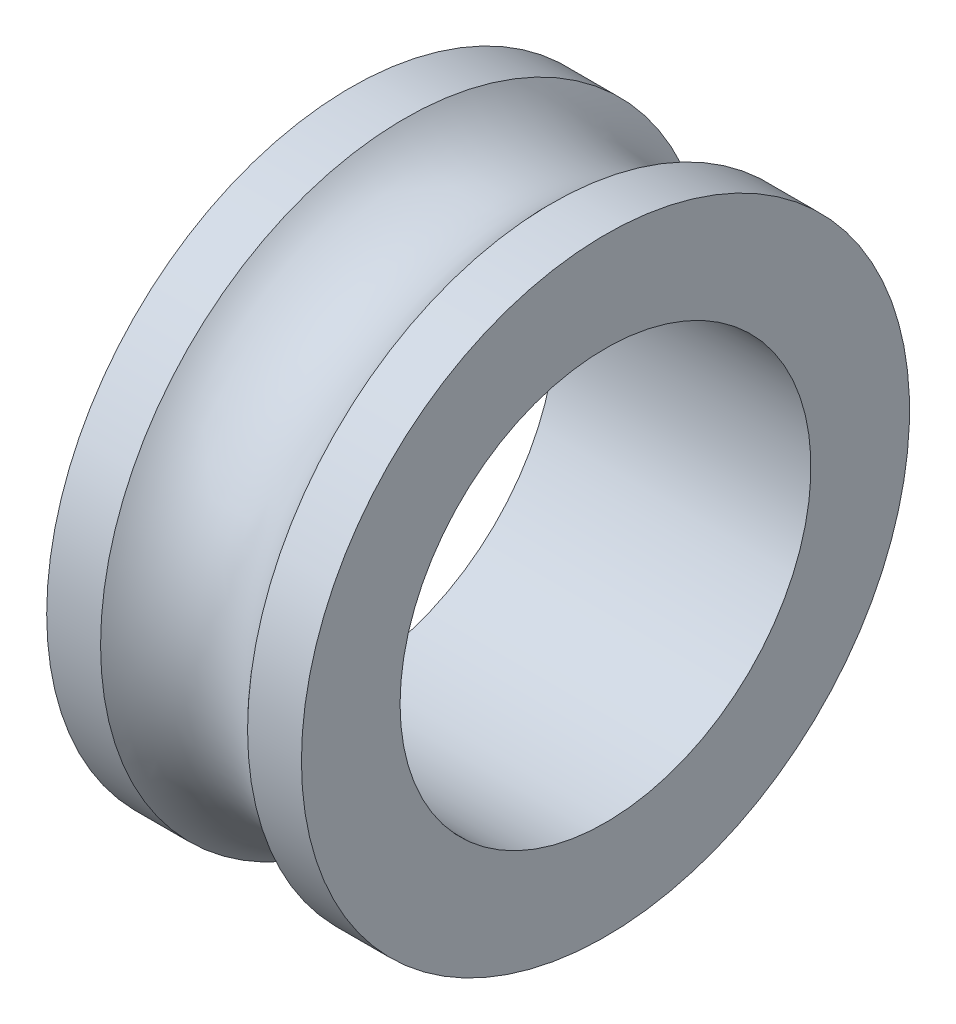
ISO-10303-21;
HEADER;
FILE_DESCRIPTION(('STEP AP214'),'2;1');
FILE_NAME('part.step','',(''),(''),'','','');
FILE_SCHEMA(('AUTOMOTIVE_DESIGN { 1 0 10303 214 1 1 1 1 }'));
ENDSEC;
DATA;
#1=APPLICATION_CONTEXT('core data for automotive mechanical design processes');
#2=APPLICATION_PROTOCOL_DEFINITION('international standard','automotive_design',2000,#1);
#3=PRODUCT_CONTEXT('',#1,'mechanical');
#4=PRODUCT('Part','Part','',(#3));
#5=PRODUCT_RELATED_PRODUCT_CATEGORY('part','',(#4));
#6=PRODUCT_DEFINITION_FORMATION('','',#4);
#7=PRODUCT_DEFINITION_CONTEXT('part definition',#1,'design');
#8=PRODUCT_DEFINITION('design','',#6,#7);
#9=PRODUCT_DEFINITION_SHAPE('','',#8);
#10=(LENGTH_UNIT() NAMED_UNIT(*) SI_UNIT(.MILLI.,.METRE.));
#11=(NAMED_UNIT(*) PLANE_ANGLE_UNIT() SI_UNIT($,.RADIAN.));
#12=(NAMED_UNIT(*) SI_UNIT($,.STERADIAN.) SOLID_ANGLE_UNIT());
#13=UNCERTAINTY_MEASURE_WITH_UNIT(LENGTH_MEASURE(1.E-05),#10,'distance_accuracy_value','');
#14=(GEOMETRIC_REPRESENTATION_CONTEXT(3) GLOBAL_UNCERTAINTY_ASSIGNED_CONTEXT((#13)) GLOBAL_UNIT_ASSIGNED_CONTEXT((#10,
#11,#12)) REPRESENTATION_CONTEXT('',''));
#15=CARTESIAN_POINT('',(0.,0.,0.));
#16=DIRECTION('',(0.,0.,1.));
#17=DIRECTION('',(1.,0.,0.));
#18=AXIS2_PLACEMENT_3D('',#15,#16,#17);
#19=CARTESIAN_POINT('',(-15.5,37.,0.));
#20=DIRECTION('',(1.,0.,0.));
#21=DIRECTION('',(0.,0.,-1.));
#22=AXIS2_PLACEMENT_3D('',#19,#20,#21);
#23=PLANE('',#22);
#24=CARTESIAN_POINT('',(-15.5,0.,0.));
#25=DIRECTION('',(-1.,0.,0.));
#26=DIRECTION('',(0.,0.,1.));
#27=AXIS2_PLACEMENT_3D('',#24,#25,#26);
#28=CIRCLE('',#27,25.);
#29=CARTESIAN_POINT('',(-15.5,0.,25.));
#30=VERTEX_POINT('',#29);
#31=EDGE_CURVE('E10',#30,#30,#28,.T.);
#32=ORIENTED_EDGE('',*,*,#31,.F.);
#33=EDGE_LOOP('',(#32));
#34=FACE_BOUND('',#33,.T.);
#35=CARTESIAN_POINT('',(-15.5,0.,0.));
#36=DIRECTION('',(-1.,0.,0.));
#37=DIRECTION('',(0.,0.,1.));
#38=AXIS2_PLACEMENT_3D('',#35,#36,#37);
#39=CIRCLE('',#38,37.);
#40=CARTESIAN_POINT('',(-15.5,0.,37.));
#41=VERTEX_POINT('',#40);
#42=EDGE_CURVE('E57',#41,#41,#39,.T.);
#43=ORIENTED_EDGE('',*,*,#42,.T.);
#44=EDGE_LOOP('',(#43));
#45=FACE_BOUND('',#44,.T.);
#46=ADVANCED_FACE('F35',(#34,#45),#23,.F.);
#47=CARTESIAN_POINT('',(-15.5,0.,0.));
#48=DIRECTION('',(-1.,0.,0.));
#49=DIRECTION('',(0.,0.,1.));
#50=AXIS2_PLACEMENT_3D('',#47,#48,#49);
#51=CYLINDRICAL_SURFACE('',#50,25.);
#52=CARTESIAN_POINT('',(15.5,0.,0.));
#53=DIRECTION('',(-1.,0.,0.));
#54=DIRECTION('',(0.,0.,1.));
#55=AXIS2_PLACEMENT_3D('',#52,#53,#54);
#56=CIRCLE('',#55,25.);
#57=CARTESIAN_POINT('',(15.5,0.,25.));
#58=VERTEX_POINT('',#57);
#59=EDGE_CURVE('E41',#58,#58,#56,.T.);
#60=ORIENTED_EDGE('',*,*,#59,.F.);
#61=EDGE_LOOP('',(#60));
#62=FACE_BOUND('',#61,.T.);
#63=ORIENTED_EDGE('',*,*,#31,.T.);
#64=EDGE_LOOP('',(#63));
#65=FACE_BOUND('',#64,.T.);
#66=ADVANCED_FACE('F82',(#62,#65),#51,.F.);
#67=CARTESIAN_POINT('',(15.5,37.,0.));
#68=DIRECTION('',(-1.,0.,0.));
#69=DIRECTION('',(0.,0.,1.));
#70=AXIS2_PLACEMENT_3D('',#67,#68,#69);
#71=PLANE('',#70);
#72=CARTESIAN_POINT('',(15.5,0.,0.));
#73=DIRECTION('',(-1.,0.,0.));
#74=DIRECTION('',(0.,0.,1.));
#75=AXIS2_PLACEMENT_3D('',#72,#73,#74);
#76=CIRCLE('',#75,37.);
#77=CARTESIAN_POINT('',(15.5,0.,37.));
#78=VERTEX_POINT('',#77);
#79=EDGE_CURVE('E45',#78,#78,#76,.T.);
#80=ORIENTED_EDGE('',*,*,#79,.F.);
#81=EDGE_LOOP('',(#80));
#82=FACE_BOUND('',#81,.T.);
#83=ORIENTED_EDGE('',*,*,#59,.T.);
#84=EDGE_LOOP('',(#83));
#85=FACE_BOUND('',#84,.T.);
#86=ADVANCED_FACE('F77',(#82,#85),#71,.F.);
#87=CARTESIAN_POINT('',(-15.5,0.,0.));
#88=DIRECTION('',(-1.,0.,0.));
#89=DIRECTION('',(0.,0.,1.));
#90=AXIS2_PLACEMENT_3D('',#87,#88,#89);
#91=CYLINDRICAL_SURFACE('',#90,37.);
#92=CARTESIAN_POINT('',(8.94427190999914,0.,0.));
#93=DIRECTION('',(-1.,0.,0.));
#94=DIRECTION('',(0.,0.,1.));
#95=AXIS2_PLACEMENT_3D('',#92,#93,#94);
#96=CIRCLE('',#95,37.);
#97=CARTESIAN_POINT('',(8.94427190999914,0.,37.));
#98=VERTEX_POINT('',#97);
#99=EDGE_CURVE('E49',#98,#98,#96,.T.);
#100=ORIENTED_EDGE('',*,*,#99,.F.);
#101=EDGE_LOOP('',(#100));
#102=FACE_BOUND('',#101,.T.);
#103=ORIENTED_EDGE('',*,*,#79,.T.);
#104=EDGE_LOOP('',(#103));
#105=FACE_BOUND('',#104,.T.);
#106=ADVANCED_FACE('F71',(#102,#105),#91,.T.);
#107=CARTESIAN_POINT('',(0.,0.,0.));
#108=DIRECTION('',(-1.,0.,0.));
#109=DIRECTION('',(0.,0.,1.));
#110=AXIS2_PLACEMENT_3D('',#107,#108,#109);
#111=TOROIDAL_SURFACE('',#110,45.,12.);
#112=CARTESIAN_POINT('',(-8.94427190999917,0.,0.));
#113=DIRECTION('',(-1.,0.,0.));
#114=DIRECTION('',(0.,0.,1.));
#115=AXIS2_PLACEMENT_3D('',#112,#113,#114);
#116=CIRCLE('',#115,37.);
#117=CARTESIAN_POINT('',(-8.94427190999917,0.,37.));
#118=VERTEX_POINT('',#117);
#119=EDGE_CURVE('E54',#118,#118,#116,.T.);
#120=ORIENTED_EDGE('',*,*,#119,.F.);
#121=EDGE_LOOP('',(#120));
#122=FACE_BOUND('',#121,.T.);
#123=ORIENTED_EDGE('',*,*,#99,.T.);
#124=EDGE_LOOP('',(#123));
#125=FACE_BOUND('',#124,.T.);
#126=ADVANCED_FACE('F65',(#122,#125),#111,.F.);
#127=CARTESIAN_POINT('',(-15.5,0.,0.));
#128=DIRECTION('',(-1.,0.,0.));
#129=DIRECTION('',(0.,0.,1.));
#130=AXIS2_PLACEMENT_3D('',#127,#128,#129);
#131=CYLINDRICAL_SURFACE('',#130,37.);
#132=ORIENTED_EDGE('',*,*,#42,.F.);
#133=EDGE_LOOP('',(#132));
#134=FACE_BOUND('',#133,.T.);
#135=ORIENTED_EDGE('',*,*,#119,.T.);
#136=EDGE_LOOP('',(#135));
#137=FACE_BOUND('',#136,.T.);
#138=ADVANCED_FACE('F62',(#134,#137),#131,.T.);
#139=CLOSED_SHELL('',(#46,#66,#86,#106,#126,#138));
#140=MANIFOLD_SOLID_BREP('B2',#139);
#141=ADVANCED_BREP_SHAPE_REPRESENTATION('',(#18,#140),#14);
#142=SHAPE_DEFINITION_REPRESENTATION(#9,#141);
ENDSEC;
END-ISO-10303-21;
